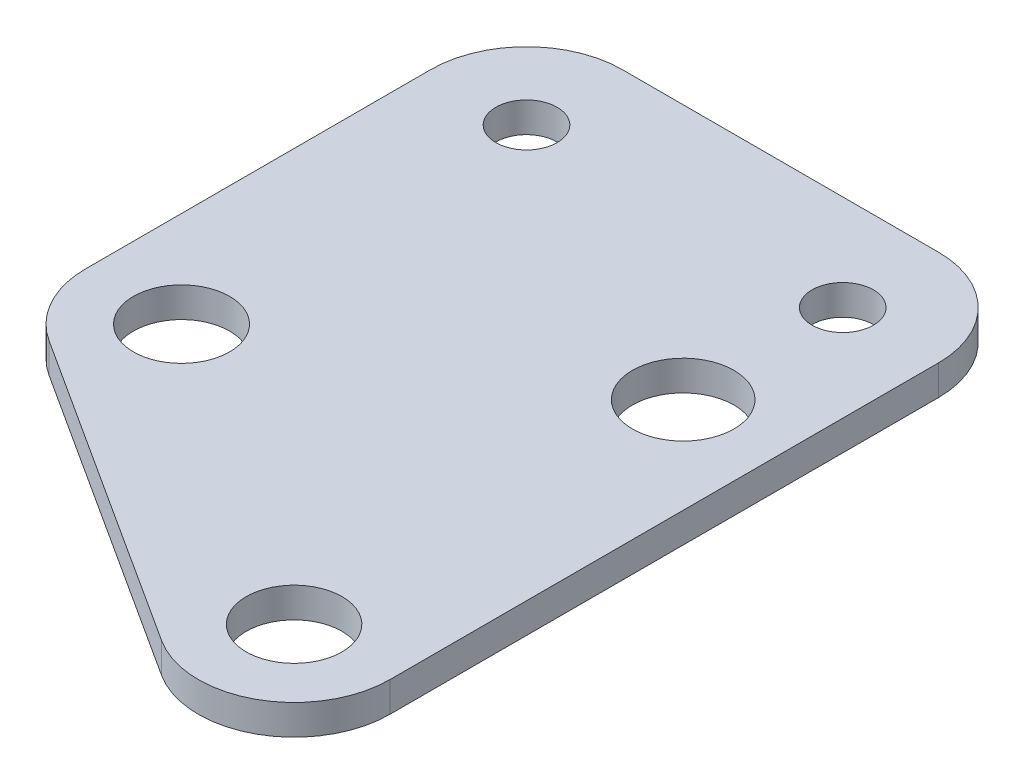
ISO-10303-21;
HEADER;
FILE_DESCRIPTION(('STEP AP214'),'2;1');
FILE_NAME('part.step','',(''),(''),'','','');
FILE_SCHEMA(('AUTOMOTIVE_DESIGN { 1 0 10303 214 1 1 1 1 }'));
ENDSEC;
DATA;
#1=APPLICATION_CONTEXT('core data for automotive mechanical design processes');
#2=APPLICATION_PROTOCOL_DEFINITION('international standard','automotive_design',2000,#1);
#3=PRODUCT_CONTEXT('',#1,'mechanical');
#4=PRODUCT('Part','Part','',(#3));
#5=PRODUCT_RELATED_PRODUCT_CATEGORY('part','',(#4));
#6=PRODUCT_DEFINITION_FORMATION('','',#4);
#7=PRODUCT_DEFINITION_CONTEXT('part definition',#1,'design');
#8=PRODUCT_DEFINITION('design','',#6,#7);
#9=PRODUCT_DEFINITION_SHAPE('','',#8);
#10=(LENGTH_UNIT() NAMED_UNIT(*) SI_UNIT(.MILLI.,.METRE.));
#11=(NAMED_UNIT(*) PLANE_ANGLE_UNIT() SI_UNIT($,.RADIAN.));
#12=(NAMED_UNIT(*) SI_UNIT($,.STERADIAN.) SOLID_ANGLE_UNIT());
#13=UNCERTAINTY_MEASURE_WITH_UNIT(LENGTH_MEASURE(1.E-05),#10,'distance_accuracy_value','');
#14=(GEOMETRIC_REPRESENTATION_CONTEXT(3) GLOBAL_UNCERTAINTY_ASSIGNED_CONTEXT((#13)) GLOBAL_UNIT_ASSIGNED_CONTEXT((#10,
#11,#12)) REPRESENTATION_CONTEXT('',''));
#15=CARTESIAN_POINT('',(0.,0.,0.));
#16=DIRECTION('',(0.,0.,1.));
#17=DIRECTION('',(1.,0.,0.));
#18=AXIS2_PLACEMENT_3D('',#15,#16,#17);
#19=CARTESIAN_POINT('',(0.,1.56999999999996,0.));
#20=DIRECTION('',(0.,-1.,0.));
#21=DIRECTION('',(0.,0.,-1.));
#22=AXIS2_PLACEMENT_3D('',#19,#20,#21);
#23=PLANE('',#22);
#24=DIRECTION('',(0.,0.,-1.));
#25=VECTOR('',#24,1.);
#26=CARTESIAN_POINT('',(26.4999999999999,1.56999999999996,0.));
#27=LINE('',#26,#25);
#28=CARTESIAN_POINT('',(26.4999999999998,1.56999999999996,33.625));
#29=VERTEX_POINT('',#28);
#30=CARTESIAN_POINT('',(26.4999999999998,1.56999999999996,5.));
#31=VERTEX_POINT('',#30);
#32=EDGE_CURVE('E174',#29,#31,#27,.T.);
#33=ORIENTED_EDGE('',*,*,#32,.T.);
#34=CARTESIAN_POINT('',(21.4999999999998,1.57000000000018,5.00000000000006));
#35=DIRECTION('',(0.,-1.,0.));
#36=DIRECTION('',(0.,0.,-1.));
#37=AXIS2_PLACEMENT_3D('',#34,#35,#36);
#38=CIRCLE('',#37,5.);
#39=CARTESIAN_POINT('',(21.4999999999998,1.57000000000018,0.));
#40=VERTEX_POINT('',#39);
#41=EDGE_CURVE('E151',#31,#40,#38,.F.);
#42=ORIENTED_EDGE('',*,*,#41,.T.);
#43=DIRECTION('',(-1.,0.,0.));
#44=VECTOR('',#43,1.);
#45=CARTESIAN_POINT('',(0.,1.56999999999996,0.));
#46=LINE('',#45,#44);
#47=CARTESIAN_POINT('',(5.,1.57000000000007,0.));
#48=VERTEX_POINT('',#47);
#49=EDGE_CURVE('E122',#40,#48,#46,.T.);
#50=ORIENTED_EDGE('',*,*,#49,.T.);
#51=CARTESIAN_POINT('',(4.99999999999978,1.57000000000007,5.00000000000006));
#52=DIRECTION('',(0.,-1.,0.));
#53=DIRECTION('',(0.,0.,-1.));
#54=AXIS2_PLACEMENT_3D('',#51,#52,#53);
#55=CIRCLE('',#54,5.);
#56=CARTESIAN_POINT('',(0.,1.56999999999996,5.00000000000003));
#57=VERTEX_POINT('',#56);
#58=EDGE_CURVE('E149',#48,#57,#55,.F.);
#59=ORIENTED_EDGE('',*,*,#58,.T.);
#60=DIRECTION('',(0.,0.,1.));
#61=VECTOR('',#60,1.);
#62=CARTESIAN_POINT('',(-2.22044604925031E-13,1.56999999999996,25.7272727272728));
#63=LINE('',#62,#61);
#64=CARTESIAN_POINT('',(-2.22044604925031E-13,1.56999999999996,23.));
#65=VERTEX_POINT('',#64);
#66=EDGE_CURVE('E129',#57,#65,#63,.T.);
#67=ORIENTED_EDGE('',*,*,#66,.T.);
#68=CARTESIAN_POINT('',(4.99999999999978,1.57000000000007,23.));
#69=DIRECTION('',(0.,-1.,0.));
#70=DIRECTION('',(0.,0.,-1.));
#71=AXIS2_PLACEMENT_3D('',#68,#69,#70);
#72=CIRCLE('',#71,5.);
#73=CARTESIAN_POINT('',(2.29299363057323,1.56999999999996,27.203821656051));
#74=VERTEX_POINT('',#73);
#75=EDGE_CURVE('E57',#65,#74,#72,.F.);
#76=ORIENTED_EDGE('',*,*,#75,.T.);
#77=DIRECTION('',(0.840764331210192,0.,0.54140127388535));
#78=VECTOR('',#77,1.);
#79=CARTESIAN_POINT('',(26.4999999999998,1.56999999999996,42.7916666666667));
#80=LINE('',#79,#78);
#81=CARTESIAN_POINT('',(18.792993630573,1.57000000000018,37.828821656051));
#82=VERTEX_POINT('',#81);
#83=EDGE_CURVE('E132',#74,#82,#80,.T.);
#84=ORIENTED_EDGE('',*,*,#83,.T.);
#85=CARTESIAN_POINT('',(21.4999999999998,1.57000000000018,33.6250000000001));
#86=DIRECTION('',(0.,-1.,0.));
#87=DIRECTION('',(0.,0.,-1.));
#88=AXIS2_PLACEMENT_3D('',#85,#86,#87);
#89=CIRCLE('',#88,5.);
#90=EDGE_CURVE('E146',#82,#29,#89,.F.);
#91=ORIENTED_EDGE('',*,*,#90,.T.);
#92=EDGE_LOOP('',(#33,#42,#50,#59,#67,#76,#84,#91));
#93=FACE_BOUND('',#92,.T.);
#94=CARTESIAN_POINT('',(21.4999999999998,1.57000000000018,33.6250000000001));
#95=DIRECTION('',(0.,1.,0.));
#96=DIRECTION('',(0.,0.,1.));
#97=AXIS2_PLACEMENT_3D('',#94,#95,#96);
#98=CIRCLE('',#97,2.5);
#99=CARTESIAN_POINT('',(21.4999999999998,1.57000000000018,31.1250000000001));
#100=VERTEX_POINT('',#99);
#101=EDGE_CURVE('E167',#100,#100,#98,.T.);
#102=ORIENTED_EDGE('',*,*,#101,.F.);
#103=EDGE_LOOP('',(#102));
#104=FACE_BOUND('',#103,.T.);
#105=CARTESIAN_POINT('',(4.99999999999978,1.57000000000007,23.));
#106=DIRECTION('',(0.,1.,0.));
#107=DIRECTION('',(0.,0.,1.));
#108=AXIS2_PLACEMENT_3D('',#105,#106,#107);
#109=CIRCLE('',#108,2.51);
#110=CARTESIAN_POINT('',(4.99999999999978,1.57000000000007,20.49));
#111=VERTEX_POINT('',#110);
#112=EDGE_CURVE('E179',#111,#111,#109,.T.);
#113=ORIENTED_EDGE('',*,*,#112,.F.);
#114=EDGE_LOOP('',(#113));
#115=FACE_BOUND('',#114,.T.);
#116=CARTESIAN_POINT('',(21.4999999999997,1.57000000000018,5.00000000000006));
#117=DIRECTION('',(0.,1.,0.));
#118=DIRECTION('',(0.,0.,1.));
#119=AXIS2_PLACEMENT_3D('',#116,#117,#118);
#120=CIRCLE('',#119,1.6);
#121=CARTESIAN_POINT('',(21.4999999999997,1.57000000000018,3.40000000000006));
#122=VERTEX_POINT('',#121);
#123=EDGE_CURVE('E184',#122,#122,#120,.T.);
#124=ORIENTED_EDGE('',*,*,#123,.F.);
#125=EDGE_LOOP('',(#124));
#126=FACE_BOUND('',#125,.T.);
#127=CARTESIAN_POINT('',(4.99999999999978,1.57000000000007,5.00000000000006));
#128=DIRECTION('',(0.,1.,0.));
#129=DIRECTION('',(0.,0.,1.));
#130=AXIS2_PLACEMENT_3D('',#127,#128,#129);
#131=CIRCLE('',#130,1.6);
#132=CARTESIAN_POINT('',(4.99999999999978,1.57000000000007,3.40000000000006));
#133=VERTEX_POINT('',#132);
#134=EDGE_CURVE('E190',#133,#133,#131,.T.);
#135=ORIENTED_EDGE('',*,*,#134,.F.);
#136=EDGE_LOOP('',(#135));
#137=FACE_BOUND('',#136,.T.);
#138=CARTESIAN_POINT('',(21.4999999999999,1.57000000000018,13.325));
#139=DIRECTION('',(0.,1.,0.));
#140=DIRECTION('',(0.,0.,1.));
#141=AXIS2_PLACEMENT_3D('',#138,#139,#140);
#142=CIRCLE('',#141,2.65);
#143=CARTESIAN_POINT('',(21.4999999999999,1.57000000000018,10.675));
#144=VERTEX_POINT('',#143);
#145=EDGE_CURVE('E196',#144,#144,#142,.T.);
#146=ORIENTED_EDGE('',*,*,#145,.F.);
#147=EDGE_LOOP('',(#146));
#148=FACE_BOUND('',#147,.T.);
#149=ADVANCED_FACE('F36',(#93,#104,#115,#126,#137,#148),#23,.F.);
#150=CARTESIAN_POINT('',(0.,0.,0.));
#151=DIRECTION('',(0.,-1.,0.));
#152=DIRECTION('',(0.,0.,-1.));
#153=AXIS2_PLACEMENT_3D('',#150,#151,#152);
#154=PLANE('',#153);
#155=CARTESIAN_POINT('',(4.99999999999978,0.,5.00000000000006));
#156=DIRECTION('',(0.,1.,0.));
#157=DIRECTION('',(0.,0.,1.));
#158=AXIS2_PLACEMENT_3D('',#155,#156,#157);
#159=CIRCLE('',#158,1.6);
#160=CARTESIAN_POINT('',(4.99999999999978,0.,3.40000000000006));
#161=VERTEX_POINT('',#160);
#162=EDGE_CURVE('E193',#161,#161,#159,.T.);
#163=ORIENTED_EDGE('',*,*,#162,.T.);
#164=EDGE_LOOP('',(#163));
#165=FACE_BOUND('',#164,.T.);
#166=CARTESIAN_POINT('',(4.99999999999978,0.,23.));
#167=DIRECTION('',(0.,1.,0.));
#168=DIRECTION('',(0.,0.,1.));
#169=AXIS2_PLACEMENT_3D('',#166,#167,#168);
#170=CIRCLE('',#169,2.51);
#171=CARTESIAN_POINT('',(4.99999999999978,0.,20.49));
#172=VERTEX_POINT('',#171);
#173=EDGE_CURVE('E181',#172,#172,#170,.T.);
#174=ORIENTED_EDGE('',*,*,#173,.T.);
#175=EDGE_LOOP('',(#174));
#176=FACE_BOUND('',#175,.T.);
#177=DIRECTION('',(-1.,0.,0.));
#178=VECTOR('',#177,1.);
#179=CARTESIAN_POINT('',(0.,0.,0.));
#180=LINE('',#179,#178);
#181=CARTESIAN_POINT('',(21.4999999999998,2.22044604925031E-13,0.));
#182=VERTEX_POINT('',#181);
#183=CARTESIAN_POINT('',(5.,0.,0.));
#184=VERTEX_POINT('',#183);
#185=EDGE_CURVE('E119',#182,#184,#180,.T.);
#186=ORIENTED_EDGE('',*,*,#185,.F.);
#187=CARTESIAN_POINT('',(21.4999999999998,2.22044604925031E-13,5.00000000000006));
#188=DIRECTION('',(0.,-1.,0.));
#189=DIRECTION('',(0.,0.,-1.));
#190=AXIS2_PLACEMENT_3D('',#187,#188,#189);
#191=CIRCLE('',#190,5.);
#192=CARTESIAN_POINT('',(26.4999999999998,0.,5.));
#193=VERTEX_POINT('',#192);
#194=EDGE_CURVE('E102',#182,#193,#191,.T.);
#195=ORIENTED_EDGE('',*,*,#194,.T.);
#196=DIRECTION('',(0.,0.,-1.));
#197=VECTOR('',#196,1.);
#198=CARTESIAN_POINT('',(26.4999999999999,0.,0.));
#199=LINE('',#198,#197);
#200=CARTESIAN_POINT('',(26.4999999999999,0.,33.625));
#201=VERTEX_POINT('',#200);
#202=EDGE_CURVE('E130',#201,#193,#199,.T.);
#203=ORIENTED_EDGE('',*,*,#202,.F.);
#204=CARTESIAN_POINT('',(21.4999999999998,2.22044604925031E-13,33.6250000000001));
#205=DIRECTION('',(0.,-1.,0.));
#206=DIRECTION('',(0.,0.,-1.));
#207=AXIS2_PLACEMENT_3D('',#204,#205,#206);
#208=CIRCLE('',#207,5.);
#209=CARTESIAN_POINT('',(18.792993630573,2.22044604925031E-13,37.828821656051));
#210=VERTEX_POINT('',#209);
#211=EDGE_CURVE('E123',#201,#210,#208,.T.);
#212=ORIENTED_EDGE('',*,*,#211,.T.);
#213=DIRECTION('',(0.840764331210192,0.,0.54140127388535));
#214=VECTOR('',#213,1.);
#215=CARTESIAN_POINT('',(26.4999999999998,0.,42.7916666666667));
#216=LINE('',#215,#214);
#217=CARTESIAN_POINT('',(2.29299363057323,0.,27.203821656051));
#218=VERTEX_POINT('',#217);
#219=EDGE_CURVE('E134',#218,#210,#216,.T.);
#220=ORIENTED_EDGE('',*,*,#219,.F.);
#221=CARTESIAN_POINT('',(4.99999999999978,0.,23.));
#222=DIRECTION('',(0.,-1.,0.));
#223=DIRECTION('',(0.,0.,-1.));
#224=AXIS2_PLACEMENT_3D('',#221,#222,#223);
#225=CIRCLE('',#224,5.);
#226=CARTESIAN_POINT('',(-2.22044604925031E-13,0.,23.));
#227=VERTEX_POINT('',#226);
#228=EDGE_CURVE('E140',#218,#227,#225,.T.);
#229=ORIENTED_EDGE('',*,*,#228,.T.);
#230=DIRECTION('',(0.,0.,1.));
#231=VECTOR('',#230,1.);
#232=CARTESIAN_POINT('',(-2.22044604925031E-13,0.,25.7272727272728));
#233=LINE('',#232,#231);
#234=CARTESIAN_POINT('',(0.,0.,5.00000000000003));
#235=VERTEX_POINT('',#234);
#236=EDGE_CURVE('E162',#235,#227,#233,.T.);
#237=ORIENTED_EDGE('',*,*,#236,.F.);
#238=CARTESIAN_POINT('',(4.99999999999978,0.,5.00000000000006));
#239=DIRECTION('',(0.,-1.,0.));
#240=DIRECTION('',(0.,0.,-1.));
#241=AXIS2_PLACEMENT_3D('',#238,#239,#240);
#242=CIRCLE('',#241,5.);
#243=EDGE_CURVE('E113',#235,#184,#242,.T.);
#244=ORIENTED_EDGE('',*,*,#243,.T.);
#245=EDGE_LOOP('',(#186,#195,#203,#212,#220,#229,#237,#244));
#246=FACE_BOUND('',#245,.T.);
#247=CARTESIAN_POINT('',(21.4999999999998,2.22044604925031E-13,33.6250000000001));
#248=DIRECTION('',(0.,1.,0.));
#249=DIRECTION('',(0.,0.,1.));
#250=AXIS2_PLACEMENT_3D('',#247,#248,#249);
#251=CIRCLE('',#250,2.5);
#252=CARTESIAN_POINT('',(21.4999999999998,2.21827764490534E-13,31.1250000000001));
#253=VERTEX_POINT('',#252);
#254=EDGE_CURVE('E170',#253,#253,#251,.T.);
#255=ORIENTED_EDGE('',*,*,#254,.T.);
#256=EDGE_LOOP('',(#255));
#257=FACE_BOUND('',#256,.T.);
#258=CARTESIAN_POINT('',(21.4999999999998,2.22044604925031E-13,5.00000000000006));
#259=DIRECTION('',(0.,1.,0.));
#260=DIRECTION('',(0.,0.,1.));
#261=AXIS2_PLACEMENT_3D('',#258,#259,#260);
#262=CIRCLE('',#261,1.6);
#263=CARTESIAN_POINT('',(21.4999999999997,2.21827764490534E-13,3.40000000000006));
#264=VERTEX_POINT('',#263);
#265=EDGE_CURVE('E187',#264,#264,#262,.T.);
#266=ORIENTED_EDGE('',*,*,#265,.T.);
#267=EDGE_LOOP('',(#266));
#268=FACE_BOUND('',#267,.T.);
#269=CARTESIAN_POINT('',(21.4999999999999,2.22044604925031E-13,13.325));
#270=DIRECTION('',(0.,1.,0.));
#271=DIRECTION('',(0.,0.,1.));
#272=AXIS2_PLACEMENT_3D('',#269,#270,#271);
#273=CIRCLE('',#272,2.65);
#274=CARTESIAN_POINT('',(21.4999999999999,2.21827764490534E-13,10.675));
#275=VERTEX_POINT('',#274);
#276=EDGE_CURVE('E199',#275,#275,#273,.T.);
#277=ORIENTED_EDGE('',*,*,#276,.T.);
#278=EDGE_LOOP('',(#277));
#279=FACE_BOUND('',#278,.T.);
#280=ADVANCED_FACE('F126',(#165,#176,#246,#257,#268,#279),#154,.T.);
#281=CARTESIAN_POINT('',(-2.22044604925031E-13,1.56999999999996,25.7272727272728));
#282=DIRECTION('',(1.,0.,0.));
#283=DIRECTION('',(0.,0.,-1.));
#284=AXIS2_PLACEMENT_3D('',#281,#282,#283);
#285=PLANE('',#284);
#286=ORIENTED_EDGE('',*,*,#66,.F.);
#287=DIRECTION('',(0.,-1.,0.));
#288=VECTOR('',#287,1.);
#289=CARTESIAN_POINT('',(0.,1.56999999999996,5.00000000000003));
#290=LINE('',#289,#288);
#291=EDGE_CURVE('E155',#57,#235,#290,.T.);
#292=ORIENTED_EDGE('',*,*,#291,.T.);
#293=ORIENTED_EDGE('',*,*,#236,.T.);
#294=DIRECTION('',(0.,-1.,0.));
#295=VECTOR('',#294,1.);
#296=CARTESIAN_POINT('',(-2.22044604925031E-13,1.56999999999996,23.));
#297=LINE('',#296,#295);
#298=EDGE_CURVE('E153',#227,#65,#297,.F.);
#299=ORIENTED_EDGE('',*,*,#298,.T.);
#300=EDGE_LOOP('',(#286,#292,#293,#299));
#301=FACE_BOUND('',#300,.T.);
#302=ADVANCED_FACE('F161',(#301),#285,.F.);
#303=CARTESIAN_POINT('',(26.4999999999998,1.56999999999996,42.7916666666667));
#304=DIRECTION('',(0.541401273885351,0.,-0.840764331210191));
#305=DIRECTION('',(-0.840764331210192,0.,-0.54140127388535));
#306=AXIS2_PLACEMENT_3D('',#303,#304,#305);
#307=PLANE('',#306);
#308=ORIENTED_EDGE('',*,*,#83,.F.);
#309=DIRECTION('',(0.,-1.,0.));
#310=VECTOR('',#309,1.);
#311=CARTESIAN_POINT('',(2.29299363057323,1.56999999999996,27.203821656051));
#312=LINE('',#311,#310);
#313=EDGE_CURVE('E11',#74,#218,#312,.T.);
#314=ORIENTED_EDGE('',*,*,#313,.T.);
#315=ORIENTED_EDGE('',*,*,#219,.T.);
#316=DIRECTION('',(0.,-1.,0.));
#317=VECTOR('',#316,1.);
#318=CARTESIAN_POINT('',(18.792993630573,1.57000000000018,37.828821656051));
#319=LINE('',#318,#317);
#320=EDGE_CURVE('E44',#210,#82,#319,.F.);
#321=ORIENTED_EDGE('',*,*,#320,.T.);
#322=EDGE_LOOP('',(#308,#314,#315,#321));
#323=FACE_BOUND('',#322,.T.);
#324=ADVANCED_FACE('F225',(#323),#307,.F.);
#325=CARTESIAN_POINT('',(26.4999999999999,1.56999999999996,0.));
#326=DIRECTION('',(-1.,0.,0.));
#327=DIRECTION('',(0.,0.,1.));
#328=AXIS2_PLACEMENT_3D('',#325,#326,#327);
#329=PLANE('',#328);
#330=ORIENTED_EDGE('',*,*,#202,.T.);
#331=DIRECTION('',(0.,-1.,0.));
#332=VECTOR('',#331,1.);
#333=CARTESIAN_POINT('',(26.4999999999998,1.56999999999996,5.));
#334=LINE('',#333,#332);
#335=EDGE_CURVE('E107',#193,#31,#334,.F.);
#336=ORIENTED_EDGE('',*,*,#335,.T.);
#337=ORIENTED_EDGE('',*,*,#32,.F.);
#338=DIRECTION('',(0.,-1.,0.));
#339=VECTOR('',#338,1.);
#340=CARTESIAN_POINT('',(26.4999999999998,1.56999999999996,33.625));
#341=LINE('',#340,#339);
#342=EDGE_CURVE('E112',#29,#201,#341,.T.);
#343=ORIENTED_EDGE('',*,*,#342,.T.);
#344=EDGE_LOOP('',(#330,#336,#337,#343));
#345=FACE_BOUND('',#344,.T.);
#346=ADVANCED_FACE('F222',(#345),#329,.F.);
#347=CARTESIAN_POINT('',(0.,1.56999999999996,0.));
#348=DIRECTION('',(0.,0.,1.));
#349=DIRECTION('',(1.,0.,0.));
#350=AXIS2_PLACEMENT_3D('',#347,#348,#349);
#351=PLANE('',#350);
#352=ORIENTED_EDGE('',*,*,#49,.F.);
#353=DIRECTION('',(0.,-1.,0.));
#354=VECTOR('',#353,1.);
#355=CARTESIAN_POINT('',(21.4999999999998,1.57000000000018,0.));
#356=LINE('',#355,#354);
#357=EDGE_CURVE('E106',#40,#182,#356,.T.);
#358=ORIENTED_EDGE('',*,*,#357,.T.);
#359=ORIENTED_EDGE('',*,*,#185,.T.);
#360=DIRECTION('',(0.,-1.,0.));
#361=VECTOR('',#360,1.);
#362=CARTESIAN_POINT('',(5.,1.57000000000007,0.));
#363=LINE('',#362,#361);
#364=EDGE_CURVE('E124',#184,#48,#363,.F.);
#365=ORIENTED_EDGE('',*,*,#364,.T.);
#366=EDGE_LOOP('',(#352,#358,#359,#365));
#367=FACE_BOUND('',#366,.T.);
#368=ADVANCED_FACE('F118',(#367),#351,.F.);
#369=CARTESIAN_POINT('',(21.4999999999998,1.57000000000018,33.6250000000001));
#370=DIRECTION('',(0.,-1.,0.));
#371=DIRECTION('',(0.,0.,-1.));
#372=AXIS2_PLACEMENT_3D('',#369,#370,#371);
#373=CYLINDRICAL_SURFACE('',#372,2.5);
#374=CARTESIAN_POINT('',(21.4999999999998,1.57000000000018,31.1250000000001));
#375=CARTESIAN_POINT('',(21.4999999999998,1.55364583333352,31.1250000000001));
#376=CARTESIAN_POINT('',(21.4999999999998,1.53729166666685,31.1250000000001));
#377=CARTESIAN_POINT('',(21.4999999999998,1.50458333333352,31.1250000000001));
#378=CARTESIAN_POINT('',(21.4999999999998,1.48822916666685,31.1250000000001));
#379=CARTESIAN_POINT('',(21.4999999999998,1.45552083333352,31.1250000000001));
#380=CARTESIAN_POINT('',(21.4999999999998,1.43916666666685,31.1250000000001));
#381=CARTESIAN_POINT('',(21.4999999999998,1.40645833333352,31.1250000000001));
#382=CARTESIAN_POINT('',(21.4999999999998,1.39010416666685,31.1250000000001));
#383=CARTESIAN_POINT('',(21.4999999999998,1.35739583333352,31.1250000000001));
#384=CARTESIAN_POINT('',(21.4999999999998,1.34104166666685,31.1250000000001));
#385=CARTESIAN_POINT('',(21.4999999999998,1.30833333333352,31.1250000000001));
#386=CARTESIAN_POINT('',(21.4999999999998,1.29197916666686,31.1250000000001));
#387=CARTESIAN_POINT('',(21.4999999999998,1.25927083333352,31.1250000000001));
#388=CARTESIAN_POINT('',(21.4999999999998,1.24291666666686,31.1250000000001));
#389=CARTESIAN_POINT('',(21.4999999999998,1.21020833333352,31.1250000000001));
#390=CARTESIAN_POINT('',(21.4999999999998,1.19385416666686,31.1250000000001));
#391=CARTESIAN_POINT('',(21.4999999999998,1.16114583333353,31.1250000000001));
#392=CARTESIAN_POINT('',(21.4999999999998,1.14479166666686,31.1250000000001));
#393=CARTESIAN_POINT('',(21.4999999999998,1.11208333333353,31.1250000000001));
#394=CARTESIAN_POINT('',(21.4999999999998,1.09572916666686,31.1250000000001));
#395=CARTESIAN_POINT('',(21.4999999999998,1.06302083333353,31.1250000000001));
#396=CARTESIAN_POINT('',(21.4999999999998,1.04666666666686,31.1250000000001));
#397=CARTESIAN_POINT('',(21.4999999999998,1.01395833333353,31.1250000000001));
#398=CARTESIAN_POINT('',(21.4999999999998,0.997604166666863,31.1250000000001));
#399=CARTESIAN_POINT('',(21.4999999999998,0.964895833333531,31.1250000000001));
#400=CARTESIAN_POINT('',(21.4999999999998,0.948541666666865,31.1250000000001));
#401=CARTESIAN_POINT('',(21.4999999999998,0.915833333333532,31.1250000000001));
#402=CARTESIAN_POINT('',(21.4999999999998,0.899479166666866,31.1250000000001));
#403=CARTESIAN_POINT('',(21.4999999999998,0.866770833333533,31.1250000000001));
#404=CARTESIAN_POINT('',(21.4999999999998,0.850416666666867,31.1250000000001));
#405=CARTESIAN_POINT('',(21.4999999999998,0.817708333333535,31.1250000000001));
#406=CARTESIAN_POINT('',(21.4999999999998,0.801354166666868,31.1250000000001));
#407=CARTESIAN_POINT('',(21.4999999999998,0.768645833333536,31.1250000000001));
#408=CARTESIAN_POINT('',(21.4999999999998,0.75229166666687,31.1250000000001));
#409=CARTESIAN_POINT('',(21.4999999999998,0.719583333333537,31.1250000000001));
#410=CARTESIAN_POINT('',(21.4999999999998,0.703229166666871,31.1250000000001));
#411=CARTESIAN_POINT('',(21.4999999999998,0.670520833333538,31.1250000000001));
#412=CARTESIAN_POINT('',(21.4999999999998,0.654166666666872,31.1250000000001));
#413=CARTESIAN_POINT('',(21.4999999999998,0.62145833333354,31.1250000000001));
#414=CARTESIAN_POINT('',(21.4999999999998,0.605104166666873,31.1250000000001));
#415=CARTESIAN_POINT('',(21.4999999999998,0.572395833333541,31.1250000000001));
#416=CARTESIAN_POINT('',(21.4999999999998,0.556041666666874,31.1250000000001));
#417=CARTESIAN_POINT('',(21.4999999999998,0.523333333333542,31.1250000000001));
#418=CARTESIAN_POINT('',(21.4999999999998,0.506979166666876,31.1250000000001));
#419=CARTESIAN_POINT('',(21.4999999999998,0.474270833333543,31.1250000000001));
#420=CARTESIAN_POINT('',(21.4999999999998,0.457916666666877,31.1250000000001));
#421=CARTESIAN_POINT('',(21.4999999999998,0.425208333333544,31.1250000000001));
#422=CARTESIAN_POINT('',(21.4999999999998,0.408854166666878,31.1250000000001));
#423=CARTESIAN_POINT('',(21.4999999999998,0.376145833333546,31.1250000000001));
#424=CARTESIAN_POINT('',(21.4999999999998,0.35979166666688,31.1250000000001));
#425=CARTESIAN_POINT('',(21.4999999999998,0.327083333333547,31.1250000000001));
#426=CARTESIAN_POINT('',(21.4999999999998,0.310729166666881,31.1250000000001));
#427=CARTESIAN_POINT('',(21.4999999999998,0.278020833333548,31.1250000000001));
#428=CARTESIAN_POINT('',(21.4999999999998,0.261666666666882,31.1250000000001));
#429=CARTESIAN_POINT('',(21.4999999999998,0.228958333333549,31.1250000000001));
#430=CARTESIAN_POINT('',(21.4999999999998,0.212604166666883,31.1250000000001));
#431=CARTESIAN_POINT('',(21.4999999999998,0.179895833333551,31.1250000000001));
#432=CARTESIAN_POINT('',(21.4999999999998,0.163541666666884,31.1250000000001));
#433=CARTESIAN_POINT('',(21.4999999999998,0.130833333333552,31.1250000000001));
#434=CARTESIAN_POINT('',(21.4999999999998,0.114479166666886,31.1250000000001));
#435=CARTESIAN_POINT('',(21.4999999999998,0.0817708333335531,31.1250000000001));
#436=CARTESIAN_POINT('',(21.4999999999998,0.0654166666668868,31.1250000000001));
#437=CARTESIAN_POINT('',(21.4999999999998,0.0327083333335543,31.1250000000001));
#438=CARTESIAN_POINT('',(21.4999999999998,0.0163541666668881,31.1250000000001));
#439=CARTESIAN_POINT('',(21.4999999999998,2.21827764490534E-13,31.1250000000001));
#440=B_SPLINE_CURVE_WITH_KNOTS('',3,(#374,#375,#376,#377,#378,#379,#380,#381,#382,#383,#384,
#385,#386,#387,#388,#389,#390,#391,#392,#393,#394,#395,#396,#397,#398,#399,#400,#401,#402,#403,
#404,#405,#406,#407,#408,#409,#410,#411,#412,#413,#414,#415,#416,#417,#418,#419,#420,#421,#422,
#423,#424,#425,#426,#427,#428,#429,#430,#431,#432,#433,#434,#435,#436,#437,#438,#439),
.UNSPECIFIED.,.F.,.F.,(4,2,2,2,2,2,2,2,2,2,2,2,2,2,2,2,2,2,2,2,2,2,2,2,2,2,2,2,2,2,2,2,4),(0.,
0.0490624999999985,0.0981249999999973,0.147187499999996,0.196249999999995,0.245312499999994,
0.294374999999992,0.343437499999991,0.39249999999999,0.441562499999989,0.490624999999987,
0.539687499999986,0.588749999999985,0.637812499999984,0.686874999999983,0.735937499999981,
0.78499999999998,0.834062499999979,0.883124999999978,0.932187499999976,0.981249999999975,
1.03031249999997,1.07937499999997,1.12843749999997,1.17749999999997,1.22656249999997,
1.27562499999997,1.32468749999997,1.37374999999997,1.42281249999996,1.47187499999996,
1.52093749999996,1.56999999999996),.UNSPECIFIED.);
#441=EDGE_CURVE('BSEAM217',#100,#253,#440,.T.);
#442=ORIENTED_EDGE('',*,*,#101,.T.);
#443=ORIENTED_EDGE('',*,*,#254,.F.);
#444=ORIENTED_EDGE('',*,*,#441,.T.);
#445=ORIENTED_EDGE('',*,*,#441,.F.);
#446=EDGE_LOOP('',(#442,#444,#443,#445));
#447=FACE_BOUND('',#446,.T.);
#448=ADVANCED_FACE('F217',(#447),#373,.F.);
#449=CARTESIAN_POINT('',(4.99999999999978,1.57000000000007,23.));
#450=DIRECTION('',(0.,-1.,0.));
#451=DIRECTION('',(0.,0.,-1.));
#452=AXIS2_PLACEMENT_3D('',#449,#450,#451);
#453=CYLINDRICAL_SURFACE('',#452,2.51);
#454=CARTESIAN_POINT('',(4.99999999999978,1.57000000000007,20.49));
#455=CARTESIAN_POINT('',(4.99999999999978,1.5536458333334,20.49));
#456=CARTESIAN_POINT('',(4.99999999999978,1.53729166666674,20.49));
#457=CARTESIAN_POINT('',(4.99999999999978,1.5045833333334,20.49));
#458=CARTESIAN_POINT('',(4.99999999999978,1.48822916666673,20.49));
#459=CARTESIAN_POINT('',(4.99999999999978,1.4555208333334,20.49));
#460=CARTESIAN_POINT('',(4.99999999999978,1.43916666666673,20.49));
#461=CARTESIAN_POINT('',(4.99999999999978,1.4064583333334,20.49));
#462=CARTESIAN_POINT('',(4.99999999999978,1.39010416666673,20.49));
#463=CARTESIAN_POINT('',(4.99999999999978,1.35739583333339,20.49));
#464=CARTESIAN_POINT('',(4.99999999999978,1.34104166666673,20.49));
#465=CARTESIAN_POINT('',(4.99999999999978,1.30833333333339,20.49));
#466=CARTESIAN_POINT('',(4.99999999999978,1.29197916666673,20.49));
#467=CARTESIAN_POINT('',(4.99999999999978,1.25927083333339,20.49));
#468=CARTESIAN_POINT('',(4.99999999999978,1.24291666666672,20.49));
#469=CARTESIAN_POINT('',(4.99999999999978,1.21020833333339,20.49));
#470=CARTESIAN_POINT('',(4.99999999999978,1.19385416666672,20.49));
#471=CARTESIAN_POINT('',(4.99999999999978,1.16114583333339,20.49));
#472=CARTESIAN_POINT('',(4.99999999999978,1.14479166666672,20.49));
#473=CARTESIAN_POINT('',(4.99999999999978,1.11208333333338,20.49));
#474=CARTESIAN_POINT('',(4.99999999999978,1.09572916666672,20.49));
#475=CARTESIAN_POINT('',(4.99999999999978,1.06302083333338,20.49));
#476=CARTESIAN_POINT('',(4.99999999999978,1.04666666666671,20.49));
#477=CARTESIAN_POINT('',(4.99999999999978,1.01395833333338,20.49));
#478=CARTESIAN_POINT('',(4.99999999999978,0.997604166666712,20.49));
#479=CARTESIAN_POINT('',(4.99999999999978,0.964895833333377,20.49));
#480=CARTESIAN_POINT('',(4.99999999999978,0.94854166666671,20.49));
#481=CARTESIAN_POINT('',(4.99999999999978,0.915833333333375,20.49));
#482=CARTESIAN_POINT('',(4.99999999999978,0.899479166666707,20.49));
#483=CARTESIAN_POINT('',(4.99999999999978,0.866770833333372,20.49));
#484=CARTESIAN_POINT('',(4.99999999999978,0.850416666666705,20.49));
#485=CARTESIAN_POINT('',(4.99999999999978,0.81770833333337,20.49));
#486=CARTESIAN_POINT('',(4.99999999999978,0.801354166666703,20.49));
#487=CARTESIAN_POINT('',(4.99999999999978,0.768645833333368,20.49));
#488=CARTESIAN_POINT('',(4.99999999999978,0.752291666666701,20.49));
#489=CARTESIAN_POINT('',(4.99999999999978,0.719583333333366,20.49));
#490=CARTESIAN_POINT('',(4.99999999999978,0.703229166666698,20.49));
#491=CARTESIAN_POINT('',(4.99999999999978,0.670520833333364,20.49));
#492=CARTESIAN_POINT('',(4.99999999999978,0.654166666666696,20.49));
#493=CARTESIAN_POINT('',(4.99999999999978,0.621458333333361,20.49));
#494=CARTESIAN_POINT('',(4.99999999999978,0.605104166666694,20.49));
#495=CARTESIAN_POINT('',(4.99999999999978,0.572395833333359,20.49));
#496=CARTESIAN_POINT('',(4.99999999999978,0.556041666666692,20.49));
#497=CARTESIAN_POINT('',(4.99999999999978,0.523333333333357,20.49));
#498=CARTESIAN_POINT('',(4.99999999999978,0.50697916666669,20.49));
#499=CARTESIAN_POINT('',(4.99999999999978,0.474270833333355,20.49));
#500=CARTESIAN_POINT('',(4.99999999999978,0.457916666666687,20.49));
#501=CARTESIAN_POINT('',(4.99999999999978,0.425208333333352,20.49));
#502=CARTESIAN_POINT('',(4.99999999999978,0.408854166666685,20.49));
#503=CARTESIAN_POINT('',(4.99999999999978,0.37614583333335,20.49));
#504=CARTESIAN_POINT('',(4.99999999999978,0.359791666666683,20.49));
#505=CARTESIAN_POINT('',(4.99999999999978,0.327083333333348,20.49));
#506=CARTESIAN_POINT('',(4.99999999999978,0.310729166666681,20.49));
#507=CARTESIAN_POINT('',(4.99999999999978,0.278020833333346,20.49));
#508=CARTESIAN_POINT('',(4.99999999999978,0.261666666666679,20.49));
#509=CARTESIAN_POINT('',(4.99999999999978,0.228958333333344,20.49));
#510=CARTESIAN_POINT('',(4.99999999999978,0.212604166666676,20.49));
#511=CARTESIAN_POINT('',(4.99999999999978,0.179895833333341,20.49));
#512=CARTESIAN_POINT('',(4.99999999999978,0.163541666666674,20.49));
#513=CARTESIAN_POINT('',(4.99999999999978,0.130833333333339,20.49));
#514=CARTESIAN_POINT('',(4.99999999999978,0.114479166666672,20.49));
#515=CARTESIAN_POINT('',(4.99999999999978,0.0817708333333368,20.49));
#516=CARTESIAN_POINT('',(4.99999999999978,0.0654166666666694,20.49));
#517=CARTESIAN_POINT('',(4.99999999999978,0.0327083333333346,20.49));
#518=CARTESIAN_POINT('',(4.99999999999978,0.0163541666666672,20.49));
#519=CARTESIAN_POINT('',(4.99999999999978,0.,20.49));
#520=B_SPLINE_CURVE_WITH_KNOTS('',3,(#454,#455,#456,#457,#458,#459,#460,#461,#462,#463,#464,
#465,#466,#467,#468,#469,#470,#471,#472,#473,#474,#475,#476,#477,#478,#479,#480,#481,#482,#483,
#484,#485,#486,#487,#488,#489,#490,#491,#492,#493,#494,#495,#496,#497,#498,#499,#500,#501,#502,
#503,#504,#505,#506,#507,#508,#509,#510,#511,#512,#513,#514,#515,#516,#517,#518,#519),
.UNSPECIFIED.,.F.,.F.,(4,2,2,2,2,2,2,2,2,2,2,2,2,2,2,2,2,2,2,2,2,2,2,2,2,2,2,2,2,2,2,2,4),(0.,
0.0490625000000024,0.0981250000000047,0.147187500000007,0.196250000000009,0.245312500000011,
0.294375000000014,0.343437500000016,0.392500000000018,0.44156250000002,0.490625000000022,
0.539687500000025,0.588750000000027,0.637812500000029,0.686875000000031,0.735937500000034,
0.785000000000036,0.834062500000038,0.88312500000004,0.932187500000043,0.981250000000045,
1.03031250000005,1.07937500000005,1.12843750000005,1.17750000000005,1.22656250000006,
1.27562500000006,1.32468750000006,1.37375000000006,1.42281250000006,1.47187500000007,
1.52093750000007,1.57000000000007),.UNSPECIFIED.);
#521=EDGE_CURVE('BSEAM280',#111,#172,#520,.T.);
#522=ORIENTED_EDGE('',*,*,#112,.T.);
#523=ORIENTED_EDGE('',*,*,#173,.F.);
#524=ORIENTED_EDGE('',*,*,#521,.T.);
#525=ORIENTED_EDGE('',*,*,#521,.F.);
#526=EDGE_LOOP('',(#522,#524,#523,#525));
#527=FACE_BOUND('',#526,.T.);
#528=ADVANCED_FACE('F280',(#527),#453,.F.);
#529=CARTESIAN_POINT('',(21.4999999999997,1.57000000000018,5.00000000000006));
#530=DIRECTION('',(0.,-1.,0.));
#531=DIRECTION('',(0.,0.,-1.));
#532=AXIS2_PLACEMENT_3D('',#529,#530,#531);
#533=CYLINDRICAL_SURFACE('',#532,1.6);
#534=CARTESIAN_POINT('',(21.4999999999997,1.57000000000018,3.40000000000006));
#535=CARTESIAN_POINT('',(21.4999999999997,1.55364583333352,3.40000000000006));
#536=CARTESIAN_POINT('',(21.4999999999997,1.53729166666685,3.40000000000006));
#537=CARTESIAN_POINT('',(21.4999999999997,1.50458333333352,3.40000000000006));
#538=CARTESIAN_POINT('',(21.4999999999997,1.48822916666685,3.40000000000006));
#539=CARTESIAN_POINT('',(21.4999999999997,1.45552083333352,3.40000000000006));
#540=CARTESIAN_POINT('',(21.4999999999997,1.43916666666685,3.40000000000006));
#541=CARTESIAN_POINT('',(21.4999999999997,1.40645833333352,3.40000000000006));
#542=CARTESIAN_POINT('',(21.4999999999997,1.39010416666685,3.40000000000006));
#543=CARTESIAN_POINT('',(21.4999999999997,1.35739583333352,3.40000000000006));
#544=CARTESIAN_POINT('',(21.4999999999997,1.34104166666685,3.40000000000006));
#545=CARTESIAN_POINT('',(21.4999999999997,1.30833333333352,3.40000000000006));
#546=CARTESIAN_POINT('',(21.4999999999997,1.29197916666686,3.40000000000006));
#547=CARTESIAN_POINT('',(21.4999999999997,1.25927083333352,3.40000000000006));
#548=CARTESIAN_POINT('',(21.4999999999997,1.24291666666686,3.40000000000006));
#549=CARTESIAN_POINT('',(21.4999999999997,1.21020833333352,3.40000000000006));
#550=CARTESIAN_POINT('',(21.4999999999997,1.19385416666686,3.40000000000006));
#551=CARTESIAN_POINT('',(21.4999999999997,1.16114583333353,3.40000000000006));
#552=CARTESIAN_POINT('',(21.4999999999997,1.14479166666686,3.40000000000006));
#553=CARTESIAN_POINT('',(21.4999999999997,1.11208333333353,3.40000000000006));
#554=CARTESIAN_POINT('',(21.4999999999997,1.09572916666686,3.40000000000006));
#555=CARTESIAN_POINT('',(21.4999999999997,1.06302083333353,3.40000000000006));
#556=CARTESIAN_POINT('',(21.4999999999997,1.04666666666686,3.40000000000006));
#557=CARTESIAN_POINT('',(21.4999999999997,1.01395833333353,3.40000000000006));
#558=CARTESIAN_POINT('',(21.4999999999997,0.997604166666863,3.40000000000006));
#559=CARTESIAN_POINT('',(21.4999999999997,0.964895833333531,3.40000000000006));
#560=CARTESIAN_POINT('',(21.4999999999997,0.948541666666865,3.40000000000006));
#561=CARTESIAN_POINT('',(21.4999999999997,0.915833333333532,3.40000000000006));
#562=CARTESIAN_POINT('',(21.4999999999997,0.899479166666866,3.40000000000006));
#563=CARTESIAN_POINT('',(21.4999999999997,0.866770833333533,3.40000000000006));
#564=CARTESIAN_POINT('',(21.4999999999997,0.850416666666867,3.40000000000006));
#565=CARTESIAN_POINT('',(21.4999999999997,0.817708333333535,3.40000000000006));
#566=CARTESIAN_POINT('',(21.4999999999997,0.801354166666868,3.40000000000006));
#567=CARTESIAN_POINT('',(21.4999999999997,0.768645833333536,3.40000000000006));
#568=CARTESIAN_POINT('',(21.4999999999997,0.75229166666687,3.40000000000006));
#569=CARTESIAN_POINT('',(21.4999999999997,0.719583333333537,3.40000000000006));
#570=CARTESIAN_POINT('',(21.4999999999997,0.703229166666871,3.40000000000006));
#571=CARTESIAN_POINT('',(21.4999999999997,0.670520833333538,3.40000000000006));
#572=CARTESIAN_POINT('',(21.4999999999997,0.654166666666872,3.40000000000006));
#573=CARTESIAN_POINT('',(21.4999999999997,0.62145833333354,3.40000000000006));
#574=CARTESIAN_POINT('',(21.4999999999997,0.605104166666873,3.40000000000006));
#575=CARTESIAN_POINT('',(21.4999999999997,0.572395833333541,3.40000000000006));
#576=CARTESIAN_POINT('',(21.4999999999997,0.556041666666874,3.40000000000006));
#577=CARTESIAN_POINT('',(21.4999999999997,0.523333333333542,3.40000000000006));
#578=CARTESIAN_POINT('',(21.4999999999997,0.506979166666876,3.40000000000006));
#579=CARTESIAN_POINT('',(21.4999999999997,0.474270833333543,3.40000000000006));
#580=CARTESIAN_POINT('',(21.4999999999997,0.457916666666877,3.40000000000006));
#581=CARTESIAN_POINT('',(21.4999999999997,0.425208333333544,3.40000000000006));
#582=CARTESIAN_POINT('',(21.4999999999997,0.408854166666878,3.40000000000006));
#583=CARTESIAN_POINT('',(21.4999999999997,0.376145833333546,3.40000000000006));
#584=CARTESIAN_POINT('',(21.4999999999997,0.35979166666688,3.40000000000006));
#585=CARTESIAN_POINT('',(21.4999999999997,0.327083333333547,3.40000000000006));
#586=CARTESIAN_POINT('',(21.4999999999997,0.310729166666881,3.40000000000006));
#587=CARTESIAN_POINT('',(21.4999999999997,0.278020833333548,3.40000000000006));
#588=CARTESIAN_POINT('',(21.4999999999997,0.261666666666882,3.40000000000006));
#589=CARTESIAN_POINT('',(21.4999999999997,0.228958333333549,3.40000000000006));
#590=CARTESIAN_POINT('',(21.4999999999997,0.212604166666883,3.40000000000006));
#591=CARTESIAN_POINT('',(21.4999999999997,0.179895833333551,3.40000000000006));
#592=CARTESIAN_POINT('',(21.4999999999997,0.163541666666884,3.40000000000006));
#593=CARTESIAN_POINT('',(21.4999999999997,0.130833333333552,3.40000000000006));
#594=CARTESIAN_POINT('',(21.4999999999997,0.114479166666886,3.40000000000006));
#595=CARTESIAN_POINT('',(21.4999999999997,0.0817708333335531,3.40000000000006));
#596=CARTESIAN_POINT('',(21.4999999999997,0.0654166666668868,3.40000000000006));
#597=CARTESIAN_POINT('',(21.4999999999997,0.0327083333335543,3.40000000000006));
#598=CARTESIAN_POINT('',(21.4999999999997,0.0163541666668881,3.40000000000006));
#599=CARTESIAN_POINT('',(21.4999999999997,2.21827764490534E-13,3.40000000000006));
#600=B_SPLINE_CURVE_WITH_KNOTS('',3,(#534,#535,#536,#537,#538,#539,#540,#541,#542,#543,#544,
#545,#546,#547,#548,#549,#550,#551,#552,#553,#554,#555,#556,#557,#558,#559,#560,#561,#562,#563,
#564,#565,#566,#567,#568,#569,#570,#571,#572,#573,#574,#575,#576,#577,#578,#579,#580,#581,#582,
#583,#584,#585,#586,#587,#588,#589,#590,#591,#592,#593,#594,#595,#596,#597,#598,#599),
.UNSPECIFIED.,.F.,.F.,(4,2,2,2,2,2,2,2,2,2,2,2,2,2,2,2,2,2,2,2,2,2,2,2,2,2,2,2,2,2,2,2,4),(0.,
0.0490624999999985,0.0981249999999973,0.147187499999996,0.196249999999995,0.245312499999994,
0.294374999999992,0.343437499999991,0.39249999999999,0.441562499999989,0.490624999999987,
0.539687499999986,0.588749999999985,0.637812499999984,0.686874999999983,0.735937499999981,
0.78499999999998,0.834062499999979,0.883124999999978,0.932187499999976,0.981249999999975,
1.03031249999997,1.07937499999997,1.12843749999997,1.17749999999997,1.22656249999997,
1.27562499999997,1.32468749999997,1.37374999999997,1.42281249999996,1.47187499999996,
1.52093749999996,1.56999999999996),.UNSPECIFIED.);
#601=EDGE_CURVE('BSEAM272',#122,#264,#600,.T.);
#602=ORIENTED_EDGE('',*,*,#123,.T.);
#603=ORIENTED_EDGE('',*,*,#265,.F.);
#604=ORIENTED_EDGE('',*,*,#601,.T.);
#605=ORIENTED_EDGE('',*,*,#601,.F.);
#606=EDGE_LOOP('',(#602,#604,#603,#605));
#607=FACE_BOUND('',#606,.T.);
#608=ADVANCED_FACE('F272',(#607),#533,.F.);
#609=CARTESIAN_POINT('',(4.99999999999978,1.57000000000007,5.00000000000006));
#610=DIRECTION('',(0.,-1.,0.));
#611=DIRECTION('',(0.,0.,-1.));
#612=AXIS2_PLACEMENT_3D('',#609,#610,#611);
#613=CYLINDRICAL_SURFACE('',#612,1.6);
#614=CARTESIAN_POINT('',(4.99999999999978,1.57000000000007,3.40000000000006));
#615=CARTESIAN_POINT('',(4.99999999999978,1.5536458333334,3.40000000000006));
#616=CARTESIAN_POINT('',(4.99999999999978,1.53729166666674,3.40000000000006));
#617=CARTESIAN_POINT('',(4.99999999999978,1.5045833333334,3.40000000000006));
#618=CARTESIAN_POINT('',(4.99999999999978,1.48822916666673,3.40000000000006));
#619=CARTESIAN_POINT('',(4.99999999999978,1.4555208333334,3.40000000000006));
#620=CARTESIAN_POINT('',(4.99999999999978,1.43916666666673,3.40000000000006));
#621=CARTESIAN_POINT('',(4.99999999999978,1.4064583333334,3.40000000000006));
#622=CARTESIAN_POINT('',(4.99999999999978,1.39010416666673,3.40000000000006));
#623=CARTESIAN_POINT('',(4.99999999999978,1.3573958333334,3.40000000000006));
#624=CARTESIAN_POINT('',(4.99999999999978,1.34104166666673,3.40000000000006));
#625=CARTESIAN_POINT('',(4.99999999999978,1.30833333333339,3.40000000000006));
#626=CARTESIAN_POINT('',(4.99999999999978,1.29197916666673,3.40000000000006));
#627=CARTESIAN_POINT('',(4.99999999999978,1.25927083333339,3.40000000000006));
#628=CARTESIAN_POINT('',(4.99999999999978,1.24291666666672,3.40000000000006));
#629=CARTESIAN_POINT('',(4.99999999999978,1.21020833333339,3.40000000000006));
#630=CARTESIAN_POINT('',(4.99999999999978,1.19385416666672,3.40000000000006));
#631=CARTESIAN_POINT('',(4.99999999999978,1.16114583333339,3.40000000000006));
#632=CARTESIAN_POINT('',(4.99999999999978,1.14479166666672,3.40000000000006));
#633=CARTESIAN_POINT('',(4.99999999999978,1.11208333333338,3.40000000000006));
#634=CARTESIAN_POINT('',(4.99999999999978,1.09572916666672,3.40000000000006));
#635=CARTESIAN_POINT('',(4.99999999999978,1.06302083333338,3.40000000000006));
#636=CARTESIAN_POINT('',(4.99999999999978,1.04666666666671,3.40000000000006));
#637=CARTESIAN_POINT('',(4.99999999999978,1.01395833333338,3.40000000000006));
#638=CARTESIAN_POINT('',(4.99999999999978,0.997604166666712,3.40000000000006));
#639=CARTESIAN_POINT('',(4.99999999999978,0.964895833333377,3.40000000000006));
#640=CARTESIAN_POINT('',(4.99999999999978,0.94854166666671,3.40000000000006));
#641=CARTESIAN_POINT('',(4.99999999999978,0.915833333333375,3.40000000000006));
#642=CARTESIAN_POINT('',(4.99999999999978,0.899479166666707,3.40000000000006));
#643=CARTESIAN_POINT('',(4.99999999999978,0.866770833333373,3.40000000000006));
#644=CARTESIAN_POINT('',(4.99999999999978,0.850416666666705,3.40000000000006));
#645=CARTESIAN_POINT('',(4.99999999999978,0.81770833333337,3.40000000000006));
#646=CARTESIAN_POINT('',(4.99999999999978,0.801354166666703,3.40000000000006));
#647=CARTESIAN_POINT('',(4.99999999999978,0.768645833333368,3.40000000000006));
#648=CARTESIAN_POINT('',(4.99999999999978,0.752291666666701,3.40000000000006));
#649=CARTESIAN_POINT('',(4.99999999999978,0.719583333333366,3.40000000000006));
#650=CARTESIAN_POINT('',(4.99999999999978,0.703229166666699,3.40000000000006));
#651=CARTESIAN_POINT('',(4.99999999999978,0.670520833333364,3.40000000000006));
#652=CARTESIAN_POINT('',(4.99999999999978,0.654166666666696,3.40000000000006));
#653=CARTESIAN_POINT('',(4.99999999999978,0.621458333333361,3.40000000000006));
#654=CARTESIAN_POINT('',(4.99999999999978,0.605104166666694,3.40000000000006));
#655=CARTESIAN_POINT('',(4.99999999999978,0.572395833333359,3.40000000000006));
#656=CARTESIAN_POINT('',(4.99999999999978,0.556041666666692,3.40000000000006));
#657=CARTESIAN_POINT('',(4.99999999999978,0.523333333333357,3.40000000000006));
#658=CARTESIAN_POINT('',(4.99999999999978,0.50697916666669,3.40000000000006));
#659=CARTESIAN_POINT('',(4.99999999999978,0.474270833333355,3.40000000000006));
#660=CARTESIAN_POINT('',(4.99999999999978,0.457916666666687,3.40000000000006));
#661=CARTESIAN_POINT('',(4.99999999999978,0.425208333333352,3.40000000000006));
#662=CARTESIAN_POINT('',(4.99999999999978,0.408854166666685,3.40000000000006));
#663=CARTESIAN_POINT('',(4.99999999999978,0.37614583333335,3.40000000000006));
#664=CARTESIAN_POINT('',(4.99999999999978,0.359791666666683,3.40000000000006));
#665=CARTESIAN_POINT('',(4.99999999999978,0.327083333333348,3.40000000000006));
#666=CARTESIAN_POINT('',(4.99999999999978,0.310729166666681,3.40000000000006));
#667=CARTESIAN_POINT('',(4.99999999999978,0.278020833333346,3.40000000000006));
#668=CARTESIAN_POINT('',(4.99999999999978,0.261666666666678,3.40000000000006));
#669=CARTESIAN_POINT('',(4.99999999999978,0.228958333333344,3.40000000000006));
#670=CARTESIAN_POINT('',(4.99999999999978,0.212604166666676,3.40000000000006));
#671=CARTESIAN_POINT('',(4.99999999999978,0.179895833333341,3.40000000000006));
#672=CARTESIAN_POINT('',(4.99999999999978,0.163541666666674,3.40000000000006));
#673=CARTESIAN_POINT('',(4.99999999999978,0.130833333333339,3.40000000000006));
#674=CARTESIAN_POINT('',(4.99999999999978,0.114479166666672,3.40000000000006));
#675=CARTESIAN_POINT('',(4.99999999999978,0.0817708333333368,3.40000000000006));
#676=CARTESIAN_POINT('',(4.99999999999978,0.0654166666666694,3.40000000000006));
#677=CARTESIAN_POINT('',(4.99999999999978,0.0327083333333346,3.40000000000006));
#678=CARTESIAN_POINT('',(4.99999999999978,0.0163541666666672,3.40000000000006));
#679=CARTESIAN_POINT('',(4.99999999999978,0.,3.40000000000006));
#680=B_SPLINE_CURVE_WITH_KNOTS('',3,(#614,#615,#616,#617,#618,#619,#620,#621,#622,#623,#624,
#625,#626,#627,#628,#629,#630,#631,#632,#633,#634,#635,#636,#637,#638,#639,#640,#641,#642,#643,
#644,#645,#646,#647,#648,#649,#650,#651,#652,#653,#654,#655,#656,#657,#658,#659,#660,#661,#662,
#663,#664,#665,#666,#667,#668,#669,#670,#671,#672,#673,#674,#675,#676,#677,#678,#679),
.UNSPECIFIED.,.F.,.F.,(4,2,2,2,2,2,2,2,2,2,2,2,2,2,2,2,2,2,2,2,2,2,2,2,2,2,2,2,2,2,2,2,4),(0.,
0.049062500000002,0.0981250000000042,0.147187500000006,0.196250000000009,0.245312500000011,
0.294375000000013,0.343437500000015,0.392500000000018,0.44156250000002,0.490625000000022,
0.539687500000024,0.588750000000027,0.637812500000029,0.686875000000031,0.735937500000033,
0.785000000000036,0.834062500000038,0.88312500000004,0.932187500000042,0.981250000000045,
1.03031250000005,1.07937500000005,1.12843750000005,1.17750000000005,1.22656250000006,
1.27562500000006,1.32468750000006,1.37375000000006,1.42281250000006,1.47187500000007,
1.52093750000007,1.57000000000007),.UNSPECIFIED.);
#681=EDGE_CURVE('BSEAM265',#133,#161,#680,.T.);
#682=ORIENTED_EDGE('',*,*,#134,.T.);
#683=ORIENTED_EDGE('',*,*,#162,.F.);
#684=ORIENTED_EDGE('',*,*,#681,.T.);
#685=ORIENTED_EDGE('',*,*,#681,.F.);
#686=EDGE_LOOP('',(#682,#684,#683,#685));
#687=FACE_BOUND('',#686,.T.);
#688=ADVANCED_FACE('F265',(#687),#613,.F.);
#689=CARTESIAN_POINT('',(21.4999999999999,1.57000000000018,13.325));
#690=DIRECTION('',(0.,-1.,0.));
#691=DIRECTION('',(0.,0.,-1.));
#692=AXIS2_PLACEMENT_3D('',#689,#690,#691);
#693=CYLINDRICAL_SURFACE('',#692,2.65);
#694=CARTESIAN_POINT('',(21.4999999999999,1.57000000000018,10.675));
#695=CARTESIAN_POINT('',(21.4999999999999,1.55364583333352,10.675));
#696=CARTESIAN_POINT('',(21.4999999999999,1.53729166666685,10.675));
#697=CARTESIAN_POINT('',(21.4999999999999,1.50458333333352,10.675));
#698=CARTESIAN_POINT('',(21.4999999999999,1.48822916666685,10.675));
#699=CARTESIAN_POINT('',(21.4999999999999,1.45552083333352,10.675));
#700=CARTESIAN_POINT('',(21.4999999999999,1.43916666666685,10.675));
#701=CARTESIAN_POINT('',(21.4999999999999,1.40645833333352,10.675));
#702=CARTESIAN_POINT('',(21.4999999999999,1.39010416666685,10.675));
#703=CARTESIAN_POINT('',(21.4999999999999,1.35739583333352,10.675));
#704=CARTESIAN_POINT('',(21.4999999999999,1.34104166666685,10.675));
#705=CARTESIAN_POINT('',(21.4999999999999,1.30833333333352,10.675));
#706=CARTESIAN_POINT('',(21.4999999999999,1.29197916666686,10.675));
#707=CARTESIAN_POINT('',(21.4999999999999,1.25927083333352,10.675));
#708=CARTESIAN_POINT('',(21.4999999999999,1.24291666666686,10.675));
#709=CARTESIAN_POINT('',(21.4999999999999,1.21020833333352,10.675));
#710=CARTESIAN_POINT('',(21.4999999999999,1.19385416666686,10.675));
#711=CARTESIAN_POINT('',(21.4999999999999,1.16114583333353,10.675));
#712=CARTESIAN_POINT('',(21.4999999999999,1.14479166666686,10.675));
#713=CARTESIAN_POINT('',(21.4999999999999,1.11208333333353,10.675));
#714=CARTESIAN_POINT('',(21.4999999999999,1.09572916666686,10.675));
#715=CARTESIAN_POINT('',(21.4999999999999,1.06302083333353,10.675));
#716=CARTESIAN_POINT('',(21.4999999999999,1.04666666666686,10.675));
#717=CARTESIAN_POINT('',(21.4999999999999,1.01395833333353,10.675));
#718=CARTESIAN_POINT('',(21.4999999999999,0.997604166666863,10.675));
#719=CARTESIAN_POINT('',(21.4999999999999,0.964895833333531,10.675));
#720=CARTESIAN_POINT('',(21.4999999999999,0.948541666666865,10.675));
#721=CARTESIAN_POINT('',(21.4999999999999,0.915833333333532,10.675));
#722=CARTESIAN_POINT('',(21.4999999999999,0.899479166666866,10.675));
#723=CARTESIAN_POINT('',(21.4999999999999,0.866770833333533,10.675));
#724=CARTESIAN_POINT('',(21.4999999999999,0.850416666666867,10.675));
#725=CARTESIAN_POINT('',(21.4999999999999,0.817708333333535,10.675));
#726=CARTESIAN_POINT('',(21.4999999999999,0.801354166666868,10.675));
#727=CARTESIAN_POINT('',(21.4999999999999,0.768645833333536,10.675));
#728=CARTESIAN_POINT('',(21.4999999999999,0.75229166666687,10.675));
#729=CARTESIAN_POINT('',(21.4999999999999,0.719583333333537,10.675));
#730=CARTESIAN_POINT('',(21.4999999999999,0.703229166666871,10.675));
#731=CARTESIAN_POINT('',(21.4999999999999,0.670520833333538,10.675));
#732=CARTESIAN_POINT('',(21.4999999999999,0.654166666666872,10.675));
#733=CARTESIAN_POINT('',(21.4999999999999,0.62145833333354,10.675));
#734=CARTESIAN_POINT('',(21.4999999999999,0.605104166666873,10.675));
#735=CARTESIAN_POINT('',(21.4999999999999,0.572395833333541,10.675));
#736=CARTESIAN_POINT('',(21.4999999999999,0.556041666666875,10.675));
#737=CARTESIAN_POINT('',(21.4999999999999,0.523333333333542,10.675));
#738=CARTESIAN_POINT('',(21.4999999999999,0.506979166666876,10.675));
#739=CARTESIAN_POINT('',(21.4999999999999,0.474270833333543,10.675));
#740=CARTESIAN_POINT('',(21.4999999999999,0.457916666666877,10.675));
#741=CARTESIAN_POINT('',(21.4999999999999,0.425208333333544,10.675));
#742=CARTESIAN_POINT('',(21.4999999999999,0.408854166666878,10.675));
#743=CARTESIAN_POINT('',(21.4999999999999,0.376145833333546,10.675));
#744=CARTESIAN_POINT('',(21.4999999999999,0.35979166666688,10.675));
#745=CARTESIAN_POINT('',(21.4999999999999,0.327083333333547,10.675));
#746=CARTESIAN_POINT('',(21.4999999999999,0.310729166666881,10.675));
#747=CARTESIAN_POINT('',(21.4999999999999,0.278020833333548,10.675));
#748=CARTESIAN_POINT('',(21.4999999999999,0.261666666666882,10.675));
#749=CARTESIAN_POINT('',(21.4999999999999,0.22895833333355,10.675));
#750=CARTESIAN_POINT('',(21.4999999999999,0.212604166666883,10.675));
#751=CARTESIAN_POINT('',(21.4999999999999,0.179895833333551,10.675));
#752=CARTESIAN_POINT('',(21.4999999999999,0.163541666666884,10.675));
#753=CARTESIAN_POINT('',(21.4999999999999,0.130833333333552,10.675));
#754=CARTESIAN_POINT('',(21.4999999999999,0.114479166666886,10.675));
#755=CARTESIAN_POINT('',(21.4999999999999,0.0817708333335531,10.675));
#756=CARTESIAN_POINT('',(21.4999999999999,0.0654166666668868,10.675));
#757=CARTESIAN_POINT('',(21.4999999999999,0.0327083333335543,10.675));
#758=CARTESIAN_POINT('',(21.4999999999999,0.0163541666668881,10.675));
#759=CARTESIAN_POINT('',(21.4999999999999,2.21827764490534E-13,10.675));
#760=B_SPLINE_CURVE_WITH_KNOTS('',3,(#694,#695,#696,#697,#698,#699,#700,#701,#702,#703,#704,
#705,#706,#707,#708,#709,#710,#711,#712,#713,#714,#715,#716,#717,#718,#719,#720,#721,#722,#723,
#724,#725,#726,#727,#728,#729,#730,#731,#732,#733,#734,#735,#736,#737,#738,#739,#740,#741,#742,
#743,#744,#745,#746,#747,#748,#749,#750,#751,#752,#753,#754,#755,#756,#757,#758,#759),
.UNSPECIFIED.,.F.,.F.,(4,2,2,2,2,2,2,2,2,2,2,2,2,2,2,2,2,2,2,2,2,2,2,2,2,2,2,2,2,2,2,2,4),(0.,
0.049062499999999,0.0981249999999977,0.147187499999997,0.196249999999995,0.245312499999994,
0.294374999999993,0.343437499999992,0.39249999999999,0.441562499999989,0.490624999999988,
0.539687499999987,0.588749999999985,0.637812499999984,0.686874999999983,0.735937499999982,
0.78499999999998,0.834062499999979,0.883124999999978,0.932187499999977,0.981249999999975,
1.03031249999997,1.07937499999997,1.12843749999997,1.17749999999997,1.22656249999997,
1.27562499999997,1.32468749999997,1.37374999999997,1.42281249999996,1.47187499999996,
1.52093749999996,1.56999999999996),.UNSPECIFIED.);
#761=EDGE_CURVE('BSEAM205',#144,#275,#760,.T.);
#762=ORIENTED_EDGE('',*,*,#145,.T.);
#763=ORIENTED_EDGE('',*,*,#276,.F.);
#764=ORIENTED_EDGE('',*,*,#761,.T.);
#765=ORIENTED_EDGE('',*,*,#761,.F.);
#766=EDGE_LOOP('',(#762,#764,#763,#765));
#767=FACE_BOUND('',#766,.T.);
#768=ADVANCED_FACE('F205',(#767),#693,.F.);
#769=CARTESIAN_POINT('',(21.4999999999998,1.57000000000018,5.00000000000006));
#770=DIRECTION('',(0.,-1.,0.));
#771=DIRECTION('',(0.,0.,-1.));
#772=AXIS2_PLACEMENT_3D('',#769,#770,#771);
#773=CYLINDRICAL_SURFACE('',#772,5.);
#774=ORIENTED_EDGE('',*,*,#41,.F.);
#775=ORIENTED_EDGE('',*,*,#335,.F.);
#776=ORIENTED_EDGE('',*,*,#194,.F.);
#777=ORIENTED_EDGE('',*,*,#357,.F.);
#778=EDGE_LOOP('',(#774,#775,#776,#777));
#779=FACE_BOUND('',#778,.T.);
#780=ADVANCED_FACE('F105',(#779),#773,.T.);
#781=CARTESIAN_POINT('',(4.99999999999978,1.57000000000007,5.00000000000006));
#782=DIRECTION('',(0.,-1.,0.));
#783=DIRECTION('',(0.,0.,-1.));
#784=AXIS2_PLACEMENT_3D('',#781,#782,#783);
#785=CYLINDRICAL_SURFACE('',#784,5.);
#786=ORIENTED_EDGE('',*,*,#58,.F.);
#787=ORIENTED_EDGE('',*,*,#364,.F.);
#788=ORIENTED_EDGE('',*,*,#243,.F.);
#789=ORIENTED_EDGE('',*,*,#291,.F.);
#790=EDGE_LOOP('',(#786,#787,#788,#789));
#791=FACE_BOUND('',#790,.T.);
#792=ADVANCED_FACE('F233',(#791),#785,.T.);
#793=CARTESIAN_POINT('',(4.99999999999978,1.57000000000007,23.));
#794=DIRECTION('',(0.,-1.,0.));
#795=DIRECTION('',(0.,0.,-1.));
#796=AXIS2_PLACEMENT_3D('',#793,#794,#795);
#797=CYLINDRICAL_SURFACE('',#796,5.);
#798=ORIENTED_EDGE('',*,*,#75,.F.);
#799=ORIENTED_EDGE('',*,*,#298,.F.);
#800=ORIENTED_EDGE('',*,*,#228,.F.);
#801=ORIENTED_EDGE('',*,*,#313,.F.);
#802=EDGE_LOOP('',(#798,#799,#800,#801));
#803=FACE_BOUND('',#802,.T.);
#804=ADVANCED_FACE('F235',(#803),#797,.T.);
#805=CARTESIAN_POINT('',(21.4999999999998,1.57000000000018,33.6250000000001));
#806=DIRECTION('',(0.,-1.,0.));
#807=DIRECTION('',(0.,0.,-1.));
#808=AXIS2_PLACEMENT_3D('',#805,#806,#807);
#809=CYLINDRICAL_SURFACE('',#808,5.);
#810=ORIENTED_EDGE('',*,*,#90,.F.);
#811=ORIENTED_EDGE('',*,*,#320,.F.);
#812=ORIENTED_EDGE('',*,*,#211,.F.);
#813=ORIENTED_EDGE('',*,*,#342,.F.);
#814=EDGE_LOOP('',(#810,#811,#812,#813));
#815=FACE_BOUND('',#814,.T.);
#816=ADVANCED_FACE('F38',(#815),#809,.T.);
#817=CLOSED_SHELL('',(#149,#280,#302,#324,#346,#368,#448,#528,#608,#688,#768,#780,#792,#804,#816));
#818=MANIFOLD_SOLID_BREP('B2',#817);
#819=ADVANCED_BREP_SHAPE_REPRESENTATION('',(#18,#818),#14);
#820=SHAPE_DEFINITION_REPRESENTATION(#9,#819);
ENDSEC;
END-ISO-10303-21;
